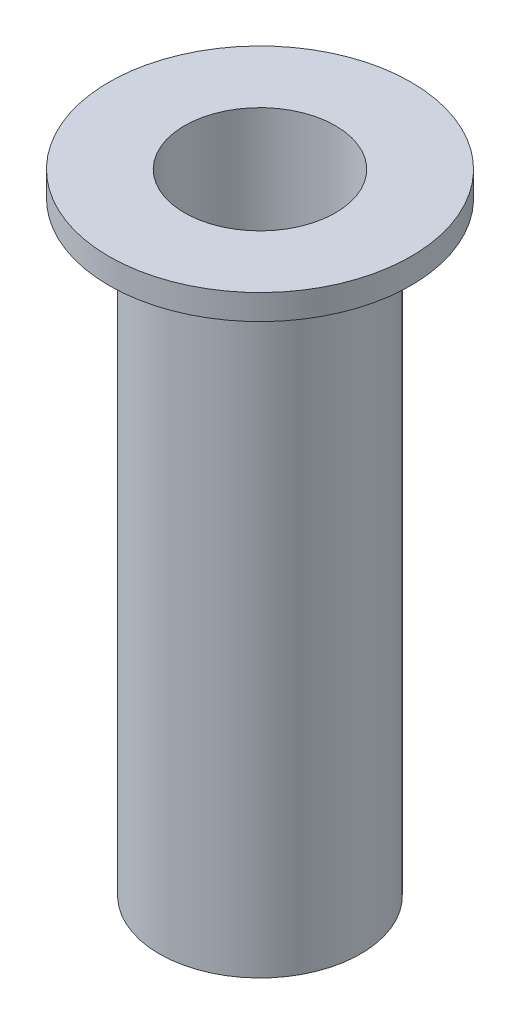
ISO-10303-21;
HEADER;
FILE_DESCRIPTION(('STEP AP214'),'2;1');
FILE_NAME('part.step','',(''),(''),'','','');
FILE_SCHEMA(('AUTOMOTIVE_DESIGN { 1 0 10303 214 1 1 1 1 }'));
ENDSEC;
DATA;
#1=APPLICATION_CONTEXT('core data for automotive mechanical design processes');
#2=APPLICATION_PROTOCOL_DEFINITION('international standard','automotive_design',2000,#1);
#3=PRODUCT_CONTEXT('',#1,'mechanical');
#4=PRODUCT('Part','Part','',(#3));
#5=PRODUCT_RELATED_PRODUCT_CATEGORY('part','',(#4));
#6=PRODUCT_DEFINITION_FORMATION('','',#4);
#7=PRODUCT_DEFINITION_CONTEXT('part definition',#1,'design');
#8=PRODUCT_DEFINITION('design','',#6,#7);
#9=PRODUCT_DEFINITION_SHAPE('','',#8);
#10=(LENGTH_UNIT() NAMED_UNIT(*) SI_UNIT(.MILLI.,.METRE.));
#11=(NAMED_UNIT(*) PLANE_ANGLE_UNIT() SI_UNIT($,.RADIAN.));
#12=(NAMED_UNIT(*) SI_UNIT($,.STERADIAN.) SOLID_ANGLE_UNIT());
#13=UNCERTAINTY_MEASURE_WITH_UNIT(LENGTH_MEASURE(1.E-05),#10,'distance_accuracy_value','');
#14=(GEOMETRIC_REPRESENTATION_CONTEXT(3) GLOBAL_UNCERTAINTY_ASSIGNED_CONTEXT((#13)) GLOBAL_UNIT_ASSIGNED_CONTEXT((#10,
#11,#12)) REPRESENTATION_CONTEXT('',''));
#15=CARTESIAN_POINT('',(0.,0.,0.));
#16=DIRECTION('',(0.,0.,1.));
#17=DIRECTION('',(1.,0.,0.));
#18=AXIS2_PLACEMENT_3D('',#15,#16,#17);
#19=CARTESIAN_POINT('',(6.,25.,0.));
#20=DIRECTION('',(0.,1.,0.));
#21=DIRECTION('',(0.,0.,1.));
#22=AXIS2_PLACEMENT_3D('',#19,#20,#21);
#23=PLANE('',#22);
#24=CARTESIAN_POINT('',(0.,25.,0.));
#25=DIRECTION('',(0.,-1.,0.));
#26=DIRECTION('',(0.,0.,-1.));
#27=AXIS2_PLACEMENT_3D('',#24,#25,#26);
#28=CIRCLE('',#27,3.);
#29=CARTESIAN_POINT('',(0.,25.,-3.));
#30=VERTEX_POINT('',#29);
#31=EDGE_CURVE('E18',#30,#30,#28,.T.);
#32=ORIENTED_EDGE('',*,*,#31,.T.);
#33=EDGE_LOOP('',(#32));
#34=FACE_BOUND('',#33,.T.);
#35=CARTESIAN_POINT('',(0.,25.,0.));
#36=DIRECTION('',(0.,-1.,0.));
#37=DIRECTION('',(0.,0.,-1.));
#38=AXIS2_PLACEMENT_3D('',#35,#36,#37);
#39=CIRCLE('',#38,6.);
#40=CARTESIAN_POINT('',(0.,25.,-6.));
#41=VERTEX_POINT('',#40);
#42=EDGE_CURVE('E34',#41,#41,#39,.T.);
#43=ORIENTED_EDGE('',*,*,#42,.F.);
#44=EDGE_LOOP('',(#43));
#45=FACE_BOUND('',#44,.T.);
#46=ADVANCED_FACE('F15',(#34,#45),#23,.T.);
#47=CARTESIAN_POINT('',(0.,12.5,0.));
#48=DIRECTION('',(0.,-1.,0.));
#49=DIRECTION('',(0.,0.,-1.));
#50=AXIS2_PLACEMENT_3D('',#47,#48,#49);
#51=CYLINDRICAL_SURFACE('',#50,3.);
#52=CARTESIAN_POINT('',(0.,0.,0.));
#53=DIRECTION('',(0.,-1.,0.));
#54=DIRECTION('',(0.,0.,-1.));
#55=AXIS2_PLACEMENT_3D('',#52,#53,#54);
#56=CIRCLE('',#55,3.);
#57=CARTESIAN_POINT('',(0.,0.,-3.));
#58=VERTEX_POINT('',#57);
#59=EDGE_CURVE('E32',#58,#58,#56,.F.);
#60=ORIENTED_EDGE('',*,*,#59,.F.);
#61=EDGE_LOOP('',(#60));
#62=FACE_BOUND('',#61,.T.);
#63=ORIENTED_EDGE('',*,*,#31,.F.);
#64=EDGE_LOOP('',(#63));
#65=FACE_BOUND('',#64,.T.);
#66=ADVANCED_FACE('F43',(#62,#65),#51,.F.);
#67=CARTESIAN_POINT('',(0.,24.5,0.));
#68=DIRECTION('',(0.,-1.,0.));
#69=DIRECTION('',(0.,0.,-1.));
#70=AXIS2_PLACEMENT_3D('',#67,#68,#69);
#71=CYLINDRICAL_SURFACE('',#70,6.);
#72=ORIENTED_EDGE('',*,*,#42,.T.);
#73=EDGE_LOOP('',(#72));
#74=FACE_BOUND('',#73,.T.);
#75=CARTESIAN_POINT('',(0.,24.,0.));
#76=DIRECTION('',(0.,-1.,0.));
#77=DIRECTION('',(0.,0.,-1.));
#78=AXIS2_PLACEMENT_3D('',#75,#76,#77);
#79=CIRCLE('',#78,6.);
#80=CARTESIAN_POINT('',(0.,24.,-6.));
#81=VERTEX_POINT('',#80);
#82=EDGE_CURVE('E27',#81,#81,#79,.T.);
#83=ORIENTED_EDGE('',*,*,#82,.F.);
#84=EDGE_LOOP('',(#83));
#85=FACE_BOUND('',#84,.T.);
#86=ADVANCED_FACE('F45',(#74,#85),#71,.T.);
#87=CARTESIAN_POINT('',(3.,0.,0.));
#88=DIRECTION('',(0.,-1.,0.));
#89=DIRECTION('',(0.,0.,-1.));
#90=AXIS2_PLACEMENT_3D('',#87,#88,#89);
#91=PLANE('',#90);
#92=ORIENTED_EDGE('',*,*,#59,.T.);
#93=EDGE_LOOP('',(#92));
#94=FACE_BOUND('',#93,.T.);
#95=CARTESIAN_POINT('',(0.,0.,0.));
#96=DIRECTION('',(0.,-1.,0.));
#97=DIRECTION('',(0.,0.,-1.));
#98=AXIS2_PLACEMENT_3D('',#95,#96,#97);
#99=CIRCLE('',#98,4.);
#100=CARTESIAN_POINT('',(0.,0.,-4.));
#101=VERTEX_POINT('',#100);
#102=EDGE_CURVE('E22',#101,#101,#99,.F.);
#103=ORIENTED_EDGE('',*,*,#102,.F.);
#104=EDGE_LOOP('',(#103));
#105=FACE_BOUND('',#104,.T.);
#106=ADVANCED_FACE('F52',(#94,#105),#91,.T.);
#107=CARTESIAN_POINT('',(4.,24.,0.));
#108=DIRECTION('',(0.,-1.,0.));
#109=DIRECTION('',(0.,0.,-1.));
#110=AXIS2_PLACEMENT_3D('',#107,#108,#109);
#111=PLANE('',#110);
#112=CARTESIAN_POINT('',(0.,24.,0.));
#113=DIRECTION('',(0.,-1.,0.));
#114=DIRECTION('',(0.,0.,-1.));
#115=AXIS2_PLACEMENT_3D('',#112,#113,#114);
#116=CIRCLE('',#115,4.);
#117=CARTESIAN_POINT('',(0.,24.,-4.));
#118=VERTEX_POINT('',#117);
#119=EDGE_CURVE('E10',#118,#118,#116,.T.);
#120=ORIENTED_EDGE('',*,*,#119,.F.);
#121=EDGE_LOOP('',(#120));
#122=FACE_BOUND('',#121,.T.);
#123=ORIENTED_EDGE('',*,*,#82,.T.);
#124=EDGE_LOOP('',(#123));
#125=FACE_BOUND('',#124,.T.);
#126=ADVANCED_FACE('F57',(#122,#125),#111,.T.);
#127=CARTESIAN_POINT('',(0.,12.,0.));
#128=DIRECTION('',(0.,-1.,0.));
#129=DIRECTION('',(0.,0.,-1.));
#130=AXIS2_PLACEMENT_3D('',#127,#128,#129);
#131=CYLINDRICAL_SURFACE('',#130,4.);
#132=ORIENTED_EDGE('',*,*,#119,.T.);
#133=EDGE_LOOP('',(#132));
#134=FACE_BOUND('',#133,.T.);
#135=ORIENTED_EDGE('',*,*,#102,.T.);
#136=EDGE_LOOP('',(#135));
#137=FACE_BOUND('',#136,.T.);
#138=ADVANCED_FACE('F55',(#134,#137),#131,.T.);
#139=CLOSED_SHELL('',(#46,#66,#86,#106,#126,#138));
#140=MANIFOLD_SOLID_BREP('B1',#139);
#141=ADVANCED_BREP_SHAPE_REPRESENTATION('',(#18,#140),#14);
#142=SHAPE_DEFINITION_REPRESENTATION(#9,#141);
ENDSEC;
END-ISO-10303-21;
